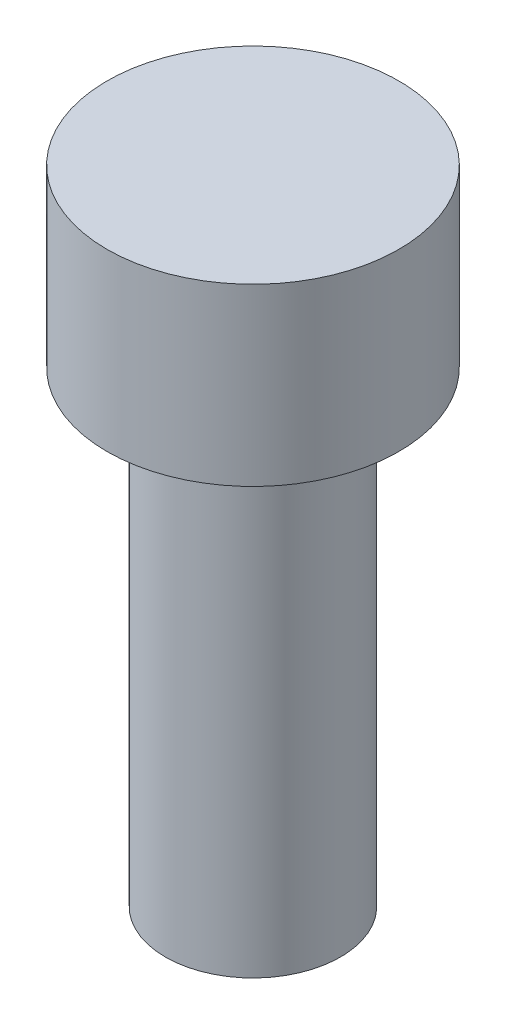
ISO-10303-21;
HEADER;
FILE_DESCRIPTION(('STEP AP214'),'2;1');
FILE_NAME('part.step','',(''),(''),'','','');
FILE_SCHEMA(('AUTOMOTIVE_DESIGN { 1 0 10303 214 1 1 1 1 }'));
ENDSEC;
DATA;
#1=APPLICATION_CONTEXT('core data for automotive mechanical design processes');
#2=APPLICATION_PROTOCOL_DEFINITION('international standard','automotive_design',2000,#1);
#3=PRODUCT_CONTEXT('',#1,'mechanical');
#4=PRODUCT('Part','Part','',(#3));
#5=PRODUCT_RELATED_PRODUCT_CATEGORY('part','',(#4));
#6=PRODUCT_DEFINITION_FORMATION('','',#4);
#7=PRODUCT_DEFINITION_CONTEXT('part definition',#1,'design');
#8=PRODUCT_DEFINITION('design','',#6,#7);
#9=PRODUCT_DEFINITION_SHAPE('','',#8);
#10=(LENGTH_UNIT() NAMED_UNIT(*) SI_UNIT(.MILLI.,.METRE.));
#11=(NAMED_UNIT(*) PLANE_ANGLE_UNIT() SI_UNIT($,.RADIAN.));
#12=(NAMED_UNIT(*) SI_UNIT($,.STERADIAN.) SOLID_ANGLE_UNIT());
#13=UNCERTAINTY_MEASURE_WITH_UNIT(LENGTH_MEASURE(1.E-05),#10,'distance_accuracy_value','');
#14=(GEOMETRIC_REPRESENTATION_CONTEXT(3) GLOBAL_UNCERTAINTY_ASSIGNED_CONTEXT((#13)) GLOBAL_UNIT_ASSIGNED_CONTEXT((#10,
#11,#12)) REPRESENTATION_CONTEXT('',''));
#15=CARTESIAN_POINT('',(0.,0.,0.));
#16=DIRECTION('',(0.,0.,1.));
#17=DIRECTION('',(1.,0.,0.));
#18=AXIS2_PLACEMENT_3D('',#15,#16,#17);
#19=CARTESIAN_POINT('',(0.,22.,5.));
#20=DIRECTION('',(0.,1.,0.));
#21=DIRECTION('',(0.,0.,1.));
#22=AXIS2_PLACEMENT_3D('',#19,#20,#21);
#23=PLANE('',#22);
#24=CARTESIAN_POINT('',(0.,22.,0.));
#25=DIRECTION('',(0.,1.,0.));
#26=DIRECTION('',(0.,0.,1.));
#27=AXIS2_PLACEMENT_3D('',#24,#25,#26);
#28=CIRCLE('',#27,5.00000000000003);
#29=CARTESIAN_POINT('',(0.,22.,5.));
#30=VERTEX_POINT('',#29);
#31=EDGE_CURVE('E45',#30,#30,#28,.T.);
#32=ORIENTED_EDGE('',*,*,#31,.T.);
#33=EDGE_LOOP('',(#32));
#34=FACE_BOUND('',#33,.T.);
#35=ADVANCED_FACE('F31',(#34),#23,.T.);
#36=CARTESIAN_POINT('',(0.,0.,0.));
#37=DIRECTION('',(0.,-1.,0.));
#38=DIRECTION('',(0.,0.,-1.));
#39=AXIS2_PLACEMENT_3D('',#36,#37,#38);
#40=PLANE('',#39);
#41=CARTESIAN_POINT('',(0.,0.,0.));
#42=DIRECTION('',(0.,1.,0.));
#43=DIRECTION('',(0.,0.,1.));
#44=AXIS2_PLACEMENT_3D('',#41,#42,#43);
#45=CIRCLE('',#44,3.);
#46=CARTESIAN_POINT('',(0.,0.,3.));
#47=VERTEX_POINT('',#46);
#48=EDGE_CURVE('E10',#47,#47,#45,.T.);
#49=ORIENTED_EDGE('',*,*,#48,.F.);
#50=EDGE_LOOP('',(#49));
#51=FACE_BOUND('',#50,.T.);
#52=ADVANCED_FACE('F63',(#51),#40,.T.);
#53=CARTESIAN_POINT('',(0.,22.,0.));
#54=DIRECTION('',(0.,1.,0.));
#55=DIRECTION('',(0.,0.,1.));
#56=AXIS2_PLACEMENT_3D('',#53,#54,#55);
#57=CYLINDRICAL_SURFACE('',#56,3.00000000000001);
#58=ORIENTED_EDGE('',*,*,#48,.T.);
#59=EDGE_LOOP('',(#58));
#60=FACE_BOUND('',#59,.T.);
#61=CARTESIAN_POINT('',(0.,16.,0.));
#62=DIRECTION('',(0.,1.,0.));
#63=DIRECTION('',(0.,0.,1.));
#64=AXIS2_PLACEMENT_3D('',#61,#62,#63);
#65=CIRCLE('',#64,3.00000000000002);
#66=CARTESIAN_POINT('',(0.,16.,3.));
#67=VERTEX_POINT('',#66);
#68=EDGE_CURVE('E37',#67,#67,#65,.T.);
#69=ORIENTED_EDGE('',*,*,#68,.F.);
#70=EDGE_LOOP('',(#69));
#71=FACE_BOUND('',#70,.T.);
#72=ADVANCED_FACE('F60',(#60,#71),#57,.T.);
#73=CARTESIAN_POINT('',(0.,16.,3.));
#74=DIRECTION('',(0.,-1.,0.));
#75=DIRECTION('',(0.,0.,-1.));
#76=AXIS2_PLACEMENT_3D('',#73,#74,#75);
#77=PLANE('',#76);
#78=ORIENTED_EDGE('',*,*,#68,.T.);
#79=EDGE_LOOP('',(#78));
#80=FACE_BOUND('',#79,.T.);
#81=CARTESIAN_POINT('',(0.,16.,0.));
#82=DIRECTION('',(0.,1.,0.));
#83=DIRECTION('',(0.,0.,1.));
#84=AXIS2_PLACEMENT_3D('',#81,#82,#83);
#85=CIRCLE('',#84,5.00000000000002);
#86=CARTESIAN_POINT('',(0.,16.,5.));
#87=VERTEX_POINT('',#86);
#88=EDGE_CURVE('E41',#87,#87,#85,.T.);
#89=ORIENTED_EDGE('',*,*,#88,.F.);
#90=EDGE_LOOP('',(#89));
#91=FACE_BOUND('',#90,.T.);
#92=ADVANCED_FACE('F54',(#80,#91),#77,.T.);
#93=CARTESIAN_POINT('',(0.,22.,0.));
#94=DIRECTION('',(0.,1.,0.));
#95=DIRECTION('',(0.,0.,1.));
#96=AXIS2_PLACEMENT_3D('',#93,#94,#95);
#97=CYLINDRICAL_SURFACE('',#96,5.00000000000002);
#98=ORIENTED_EDGE('',*,*,#88,.T.);
#99=EDGE_LOOP('',(#98));
#100=FACE_BOUND('',#99,.T.);
#101=ORIENTED_EDGE('',*,*,#31,.F.);
#102=EDGE_LOOP('',(#101));
#103=FACE_BOUND('',#102,.T.);
#104=ADVANCED_FACE('F52',(#100,#103),#97,.T.);
#105=CLOSED_SHELL('',(#35,#52,#72,#92,#104));
#106=MANIFOLD_SOLID_BREP('B2',#105);
#107=ADVANCED_BREP_SHAPE_REPRESENTATION('',(#18,#106),#14);
#108=SHAPE_DEFINITION_REPRESENTATION(#9,#107);
ENDSEC;
END-ISO-10303-21;
